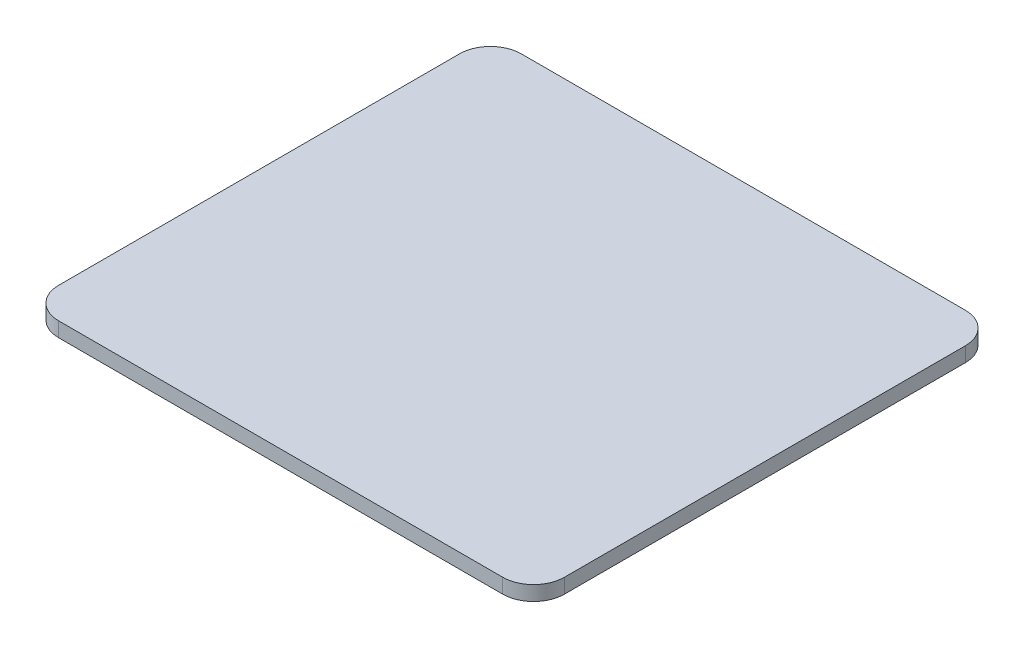
ISO-10303-21;
HEADER;
FILE_DESCRIPTION(('STEP AP214'),'2;1');
FILE_NAME('part.step','',(''),(''),'','','');
FILE_SCHEMA(('AUTOMOTIVE_DESIGN { 1 0 10303 214 1 1 1 1 }'));
ENDSEC;
DATA;
#1=APPLICATION_CONTEXT('core data for automotive mechanical design processes');
#2=APPLICATION_PROTOCOL_DEFINITION('international standard','automotive_design',2000,#1);
#3=PRODUCT_CONTEXT('',#1,'mechanical');
#4=PRODUCT('Part','Part','',(#3));
#5=PRODUCT_RELATED_PRODUCT_CATEGORY('part','',(#4));
#6=PRODUCT_DEFINITION_FORMATION('','',#4);
#7=PRODUCT_DEFINITION_CONTEXT('part definition',#1,'design');
#8=PRODUCT_DEFINITION('design','',#6,#7);
#9=PRODUCT_DEFINITION_SHAPE('','',#8);
#10=(LENGTH_UNIT() NAMED_UNIT(*) SI_UNIT(.MILLI.,.METRE.));
#11=(NAMED_UNIT(*) PLANE_ANGLE_UNIT() SI_UNIT($,.RADIAN.));
#12=(NAMED_UNIT(*) SI_UNIT($,.STERADIAN.) SOLID_ANGLE_UNIT());
#13=UNCERTAINTY_MEASURE_WITH_UNIT(LENGTH_MEASURE(1.E-05),#10,'distance_accuracy_value','');
#14=(GEOMETRIC_REPRESENTATION_CONTEXT(3) GLOBAL_UNCERTAINTY_ASSIGNED_CONTEXT((#13)) GLOBAL_UNIT_ASSIGNED_CONTEXT((#10,
#11,#12)) REPRESENTATION_CONTEXT('',''));
#15=CARTESIAN_POINT('',(0.,0.,0.));
#16=DIRECTION('',(0.,0.,1.));
#17=DIRECTION('',(1.,0.,0.));
#18=AXIS2_PLACEMENT_3D('',#15,#16,#17);
#19=CARTESIAN_POINT('',(-82.,4.7625,75.));
#20=DIRECTION('',(1.,0.,0.));
#21=DIRECTION('',(0.,0.,-1.));
#22=AXIS2_PLACEMENT_3D('',#19,#20,#21);
#23=PLANE('',#22);
#24=DIRECTION('',(0.,0.,1.));
#25=VECTOR('',#24,1.);
#26=CARTESIAN_POINT('',(-82.,4.7625,75.));
#27=LINE('',#26,#25);
#28=CARTESIAN_POINT('',(-82.,4.7625,-65.));
#29=VERTEX_POINT('',#28);
#30=CARTESIAN_POINT('',(-82.,4.7625,65.));
#31=VERTEX_POINT('',#30);
#32=EDGE_CURVE('E122',#29,#31,#27,.T.);
#33=ORIENTED_EDGE('',*,*,#32,.F.);
#34=DIRECTION('',(0.,-1.,0.));
#35=VECTOR('',#34,1.);
#36=CARTESIAN_POINT('',(-82.,4.7625,-65.));
#37=LINE('',#36,#35);
#38=CARTESIAN_POINT('',(-82.,0.,-65.));
#39=VERTEX_POINT('',#38);
#40=EDGE_CURVE('E107',#29,#39,#37,.T.);
#41=ORIENTED_EDGE('',*,*,#40,.T.);
#42=DIRECTION('',(0.,0.,1.));
#43=VECTOR('',#42,1.);
#44=CARTESIAN_POINT('',(-82.,0.,75.));
#45=LINE('',#44,#43);
#46=CARTESIAN_POINT('',(-82.,0.,65.));
#47=VERTEX_POINT('',#46);
#48=EDGE_CURVE('E119',#39,#47,#45,.T.);
#49=ORIENTED_EDGE('',*,*,#48,.T.);
#50=DIRECTION('',(0.,-1.,0.));
#51=VECTOR('',#50,1.);
#52=CARTESIAN_POINT('',(-82.,4.7625,65.));
#53=LINE('',#52,#51);
#54=EDGE_CURVE('E124',#47,#31,#53,.F.);
#55=ORIENTED_EDGE('',*,*,#54,.T.);
#56=EDGE_LOOP('',(#33,#41,#49,#55));
#57=FACE_BOUND('',#56,.T.);
#58=ADVANCED_FACE('F37',(#57),#23,.F.);
#59=CARTESIAN_POINT('',(82.,4.7625,75.));
#60=DIRECTION('',(0.,0.,-1.));
#61=DIRECTION('',(-1.,0.,0.));
#62=AXIS2_PLACEMENT_3D('',#59,#60,#61);
#63=PLANE('',#62);
#64=DIRECTION('',(1.,0.,0.));
#65=VECTOR('',#64,1.);
#66=CARTESIAN_POINT('',(82.,0.,75.));
#67=LINE('',#66,#65);
#68=CARTESIAN_POINT('',(-72.,0.,75.));
#69=VERTEX_POINT('',#68);
#70=CARTESIAN_POINT('',(72.,0.,75.));
#71=VERTEX_POINT('',#70);
#72=EDGE_CURVE('E128',#69,#71,#67,.T.);
#73=ORIENTED_EDGE('',*,*,#72,.T.);
#74=DIRECTION('',(0.,-1.,0.));
#75=VECTOR('',#74,1.);
#76=CARTESIAN_POINT('',(72.,4.7625,75.));
#77=LINE('',#76,#75);
#78=CARTESIAN_POINT('',(72.,4.7625,75.));
#79=VERTEX_POINT('',#78);
#80=EDGE_CURVE('E11',#71,#79,#77,.F.);
#81=ORIENTED_EDGE('',*,*,#80,.T.);
#82=DIRECTION('',(1.,0.,0.));
#83=VECTOR('',#82,1.);
#84=CARTESIAN_POINT('',(82.,4.7625,75.));
#85=LINE('',#84,#83);
#86=CARTESIAN_POINT('',(-72.,4.7625,75.));
#87=VERTEX_POINT('',#86);
#88=EDGE_CURVE('E164',#87,#79,#85,.T.);
#89=ORIENTED_EDGE('',*,*,#88,.F.);
#90=DIRECTION('',(0.,-1.,0.));
#91=VECTOR('',#90,1.);
#92=CARTESIAN_POINT('',(-72.,4.7625,75.));
#93=LINE('',#92,#91);
#94=EDGE_CURVE('E45',#87,#69,#93,.T.);
#95=ORIENTED_EDGE('',*,*,#94,.T.);
#96=EDGE_LOOP('',(#73,#81,#89,#95));
#97=FACE_BOUND('',#96,.T.);
#98=ADVANCED_FACE('F162',(#97),#63,.F.);
#99=CARTESIAN_POINT('',(82.,4.7625,75.));
#100=DIRECTION('',(-1.,0.,0.));
#101=DIRECTION('',(0.,0.,1.));
#102=AXIS2_PLACEMENT_3D('',#99,#100,#101);
#103=PLANE('',#102);
#104=DIRECTION('',(0.,0.,-1.));
#105=VECTOR('',#104,1.);
#106=CARTESIAN_POINT('',(82.,0.,75.));
#107=LINE('',#106,#105);
#108=CARTESIAN_POINT('',(82.,0.,65.));
#109=VERTEX_POINT('',#108);
#110=CARTESIAN_POINT('',(82.,0.,-65.));
#111=VERTEX_POINT('',#110);
#112=EDGE_CURVE('E131',#109,#111,#107,.T.);
#113=ORIENTED_EDGE('',*,*,#112,.T.);
#114=DIRECTION('',(0.,-1.,0.));
#115=VECTOR('',#114,1.);
#116=CARTESIAN_POINT('',(82.,4.7625,-65.));
#117=LINE('',#116,#115);
#118=CARTESIAN_POINT('',(82.,4.7625,-65.));
#119=VERTEX_POINT('',#118);
#120=EDGE_CURVE('E52',#111,#119,#117,.F.);
#121=ORIENTED_EDGE('',*,*,#120,.T.);
#122=DIRECTION('',(0.,0.,-1.));
#123=VECTOR('',#122,1.);
#124=CARTESIAN_POINT('',(82.,4.7625,75.));
#125=LINE('',#124,#123);
#126=CARTESIAN_POINT('',(82.,4.7625,65.));
#127=VERTEX_POINT('',#126);
#128=EDGE_CURVE('E172',#127,#119,#125,.T.);
#129=ORIENTED_EDGE('',*,*,#128,.F.);
#130=DIRECTION('',(0.,-1.,0.));
#131=VECTOR('',#130,1.);
#132=CARTESIAN_POINT('',(82.,4.7625,65.));
#133=LINE('',#132,#131);
#134=EDGE_CURVE('E155',#127,#109,#133,.T.);
#135=ORIENTED_EDGE('',*,*,#134,.T.);
#136=EDGE_LOOP('',(#113,#121,#129,#135));
#137=FACE_BOUND('',#136,.T.);
#138=ADVANCED_FACE('F171',(#137),#103,.F.);
#139=CARTESIAN_POINT('',(82.,4.7625,-75.));
#140=DIRECTION('',(0.,0.,1.));
#141=DIRECTION('',(1.,0.,0.));
#142=AXIS2_PLACEMENT_3D('',#139,#140,#141);
#143=PLANE('',#142);
#144=DIRECTION('',(-1.,0.,0.));
#145=VECTOR('',#144,1.);
#146=CARTESIAN_POINT('',(82.,0.,-75.));
#147=LINE('',#146,#145);
#148=CARTESIAN_POINT('',(72.,0.,-75.));
#149=VERTEX_POINT('',#148);
#150=CARTESIAN_POINT('',(-72.,0.,-75.));
#151=VERTEX_POINT('',#150);
#152=EDGE_CURVE('E138',#149,#151,#147,.T.);
#153=ORIENTED_EDGE('',*,*,#152,.T.);
#154=DIRECTION('',(0.,-1.,0.));
#155=VECTOR('',#154,1.);
#156=CARTESIAN_POINT('',(-72.,4.7625,-75.));
#157=LINE('',#156,#155);
#158=CARTESIAN_POINT('',(-72.,4.7625,-75.));
#159=VERTEX_POINT('',#158);
#160=EDGE_CURVE('E108',#151,#159,#157,.F.);
#161=ORIENTED_EDGE('',*,*,#160,.T.);
#162=DIRECTION('',(-1.,0.,0.));
#163=VECTOR('',#162,1.);
#164=CARTESIAN_POINT('',(82.,4.7625,-75.));
#165=LINE('',#164,#163);
#166=CARTESIAN_POINT('',(72.,4.7625,-75.));
#167=VERTEX_POINT('',#166);
#168=EDGE_CURVE('E134',#167,#159,#165,.T.);
#169=ORIENTED_EDGE('',*,*,#168,.F.);
#170=DIRECTION('',(0.,-1.,0.));
#171=VECTOR('',#170,1.);
#172=CARTESIAN_POINT('',(72.,4.7625,-75.));
#173=LINE('',#172,#171);
#174=EDGE_CURVE('E113',#167,#149,#173,.T.);
#175=ORIENTED_EDGE('',*,*,#174,.T.);
#176=EDGE_LOOP('',(#153,#161,#169,#175));
#177=FACE_BOUND('',#176,.T.);
#178=ADVANCED_FACE('F200',(#177),#143,.F.);
#179=CARTESIAN_POINT('',(0.,4.7625,0.));
#180=DIRECTION('',(0.,1.,0.));
#181=DIRECTION('',(0.,0.,1.));
#182=AXIS2_PLACEMENT_3D('',#179,#180,#181);
#183=PLANE('',#182);
#184=ORIENTED_EDGE('',*,*,#168,.T.);
#185=CARTESIAN_POINT('',(-72.,4.7625,-65.));
#186=DIRECTION('',(0.,1.,0.));
#187=DIRECTION('',(0.,0.,1.));
#188=AXIS2_PLACEMENT_3D('',#185,#186,#187);
#189=CIRCLE('',#188,10.);
#190=EDGE_CURVE('E153',#159,#29,#189,.T.);
#191=ORIENTED_EDGE('',*,*,#190,.T.);
#192=ORIENTED_EDGE('',*,*,#32,.T.);
#193=CARTESIAN_POINT('',(-72.,4.7625,65.));
#194=DIRECTION('',(0.,1.,0.));
#195=DIRECTION('',(0.,0.,1.));
#196=AXIS2_PLACEMENT_3D('',#193,#194,#195);
#197=CIRCLE('',#196,10.);
#198=EDGE_CURVE('E148',#31,#87,#197,.T.);
#199=ORIENTED_EDGE('',*,*,#198,.T.);
#200=ORIENTED_EDGE('',*,*,#88,.T.);
#201=CARTESIAN_POINT('',(72.,4.7625,65.));
#202=DIRECTION('',(0.,1.,0.));
#203=DIRECTION('',(0.,0.,1.));
#204=AXIS2_PLACEMENT_3D('',#201,#202,#203);
#205=CIRCLE('',#204,10.);
#206=EDGE_CURVE('E59',#79,#127,#205,.T.);
#207=ORIENTED_EDGE('',*,*,#206,.T.);
#208=ORIENTED_EDGE('',*,*,#128,.T.);
#209=CARTESIAN_POINT('',(72.,4.7625,-65.));
#210=DIRECTION('',(0.,1.,0.));
#211=DIRECTION('',(0.,0.,1.));
#212=AXIS2_PLACEMENT_3D('',#209,#210,#211);
#213=CIRCLE('',#212,10.);
#214=EDGE_CURVE('E151',#119,#167,#213,.T.);
#215=ORIENTED_EDGE('',*,*,#214,.T.);
#216=EDGE_LOOP('',(#184,#191,#192,#199,#200,#207,#208,#215));
#217=FACE_BOUND('',#216,.T.);
#218=ADVANCED_FACE('F177',(#217),#183,.T.);
#219=CARTESIAN_POINT('',(0.,0.,0.));
#220=DIRECTION('',(0.,1.,0.));
#221=DIRECTION('',(0.,0.,1.));
#222=AXIS2_PLACEMENT_3D('',#219,#220,#221);
#223=PLANE('',#222);
#224=ORIENTED_EDGE('',*,*,#48,.F.);
#225=CARTESIAN_POINT('',(-72.,0.,-65.));
#226=DIRECTION('',(0.,1.,0.));
#227=DIRECTION('',(0.,0.,1.));
#228=AXIS2_PLACEMENT_3D('',#225,#226,#227);
#229=CIRCLE('',#228,10.);
#230=EDGE_CURVE('E103',#39,#151,#229,.F.);
#231=ORIENTED_EDGE('',*,*,#230,.T.);
#232=ORIENTED_EDGE('',*,*,#152,.F.);
#233=CARTESIAN_POINT('',(72.,0.,-65.));
#234=DIRECTION('',(0.,1.,0.));
#235=DIRECTION('',(0.,0.,1.));
#236=AXIS2_PLACEMENT_3D('',#233,#234,#235);
#237=CIRCLE('',#236,10.);
#238=EDGE_CURVE('E114',#149,#111,#237,.F.);
#239=ORIENTED_EDGE('',*,*,#238,.T.);
#240=ORIENTED_EDGE('',*,*,#112,.F.);
#241=CARTESIAN_POINT('',(72.,0.,65.));
#242=DIRECTION('',(0.,1.,0.));
#243=DIRECTION('',(0.,0.,1.));
#244=AXIS2_PLACEMENT_3D('',#241,#242,#243);
#245=CIRCLE('',#244,10.);
#246=EDGE_CURVE('E142',#109,#71,#245,.F.);
#247=ORIENTED_EDGE('',*,*,#246,.T.);
#248=ORIENTED_EDGE('',*,*,#72,.F.);
#249=CARTESIAN_POINT('',(-72.,0.,65.));
#250=DIRECTION('',(0.,1.,0.));
#251=DIRECTION('',(0.,0.,1.));
#252=AXIS2_PLACEMENT_3D('',#249,#250,#251);
#253=CIRCLE('',#252,10.);
#254=EDGE_CURVE('E123',#69,#47,#253,.F.);
#255=ORIENTED_EDGE('',*,*,#254,.T.);
#256=EDGE_LOOP('',(#224,#231,#232,#239,#240,#247,#248,#255));
#257=FACE_BOUND('',#256,.T.);
#258=ADVANCED_FACE('F126',(#257),#223,.F.);
#259=CARTESIAN_POINT('',(-72.,4.7625,-65.));
#260=DIRECTION('',(0.,-1.,0.));
#261=DIRECTION('',(0.,0.,-1.));
#262=AXIS2_PLACEMENT_3D('',#259,#260,#261);
#263=CYLINDRICAL_SURFACE('',#262,10.);
#264=ORIENTED_EDGE('',*,*,#190,.F.);
#265=ORIENTED_EDGE('',*,*,#160,.F.);
#266=ORIENTED_EDGE('',*,*,#230,.F.);
#267=ORIENTED_EDGE('',*,*,#40,.F.);
#268=EDGE_LOOP('',(#264,#265,#266,#267));
#269=FACE_BOUND('',#268,.T.);
#270=ADVANCED_FACE('F106',(#269),#263,.T.);
#271=CARTESIAN_POINT('',(72.,4.7625,-65.));
#272=DIRECTION('',(0.,-1.,0.));
#273=DIRECTION('',(0.,0.,-1.));
#274=AXIS2_PLACEMENT_3D('',#271,#272,#273);
#275=CYLINDRICAL_SURFACE('',#274,10.);
#276=ORIENTED_EDGE('',*,*,#214,.F.);
#277=ORIENTED_EDGE('',*,*,#120,.F.);
#278=ORIENTED_EDGE('',*,*,#238,.F.);
#279=ORIENTED_EDGE('',*,*,#174,.F.);
#280=EDGE_LOOP('',(#276,#277,#278,#279));
#281=FACE_BOUND('',#280,.T.);
#282=ADVANCED_FACE('F182',(#281),#275,.T.);
#283=CARTESIAN_POINT('',(72.,4.7625,65.));
#284=DIRECTION('',(0.,-1.,0.));
#285=DIRECTION('',(0.,0.,-1.));
#286=AXIS2_PLACEMENT_3D('',#283,#284,#285);
#287=CYLINDRICAL_SURFACE('',#286,10.);
#288=ORIENTED_EDGE('',*,*,#206,.F.);
#289=ORIENTED_EDGE('',*,*,#80,.F.);
#290=ORIENTED_EDGE('',*,*,#246,.F.);
#291=ORIENTED_EDGE('',*,*,#134,.F.);
#292=EDGE_LOOP('',(#288,#289,#290,#291));
#293=FACE_BOUND('',#292,.T.);
#294=ADVANCED_FACE('F170',(#293),#287,.T.);
#295=CARTESIAN_POINT('',(-72.,4.7625,65.));
#296=DIRECTION('',(0.,-1.,0.));
#297=DIRECTION('',(0.,0.,-1.));
#298=AXIS2_PLACEMENT_3D('',#295,#296,#297);
#299=CYLINDRICAL_SURFACE('',#298,10.);
#300=ORIENTED_EDGE('',*,*,#198,.F.);
#301=ORIENTED_EDGE('',*,*,#54,.F.);
#302=ORIENTED_EDGE('',*,*,#254,.F.);
#303=ORIENTED_EDGE('',*,*,#94,.F.);
#304=EDGE_LOOP('',(#300,#301,#302,#303));
#305=FACE_BOUND('',#304,.T.);
#306=ADVANCED_FACE('F39',(#305),#299,.T.);
#307=CLOSED_SHELL('',(#58,#98,#138,#178,#218,#258,#270,#282,#294,#306));
#308=MANIFOLD_SOLID_BREP('B2',#307);
#309=ADVANCED_BREP_SHAPE_REPRESENTATION('',(#18,#308),#14);
#310=SHAPE_DEFINITION_REPRESENTATION(#9,#309);
ENDSEC;
END-ISO-10303-21;
